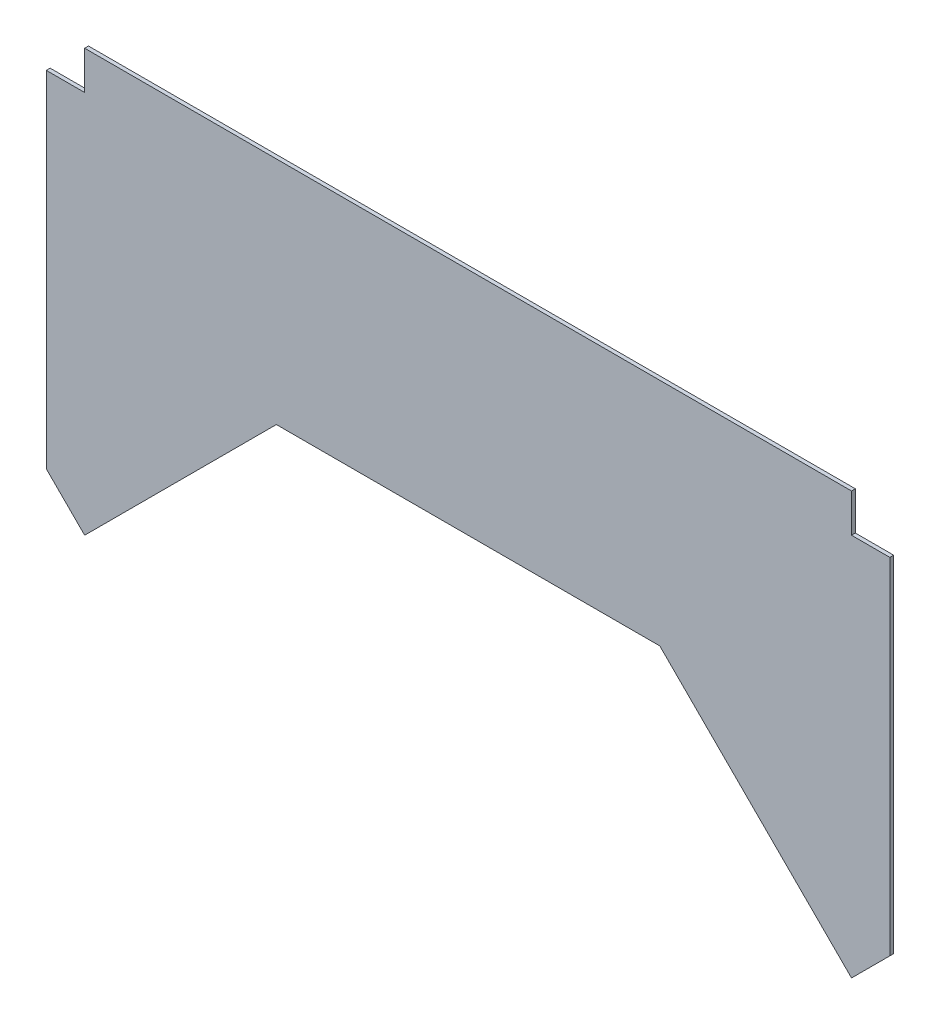
ISO-10303-21;
HEADER;
FILE_DESCRIPTION(('STEP AP214'),'2;1');
FILE_NAME('part.step','',(''),(''),'','','');
FILE_SCHEMA(('AUTOMOTIVE_DESIGN { 1 0 10303 214 1 1 1 1 }'));
ENDSEC;
DATA;
#1=APPLICATION_CONTEXT('core data for automotive mechanical design processes');
#2=APPLICATION_PROTOCOL_DEFINITION('international standard','automotive_design',2000,#1);
#3=PRODUCT_CONTEXT('',#1,'mechanical');
#4=PRODUCT('Part','Part','',(#3));
#5=PRODUCT_RELATED_PRODUCT_CATEGORY('part','',(#4));
#6=PRODUCT_DEFINITION_FORMATION('','',#4);
#7=PRODUCT_DEFINITION_CONTEXT('part definition',#1,'design');
#8=PRODUCT_DEFINITION('design','',#6,#7);
#9=PRODUCT_DEFINITION_SHAPE('','',#8);
#10=(LENGTH_UNIT() NAMED_UNIT(*) SI_UNIT(.MILLI.,.METRE.));
#11=(NAMED_UNIT(*) PLANE_ANGLE_UNIT() SI_UNIT($,.RADIAN.));
#12=(NAMED_UNIT(*) SI_UNIT($,.STERADIAN.) SOLID_ANGLE_UNIT());
#13=UNCERTAINTY_MEASURE_WITH_UNIT(LENGTH_MEASURE(1.E-05),#10,'distance_accuracy_value','');
#14=(GEOMETRIC_REPRESENTATION_CONTEXT(3) GLOBAL_UNCERTAINTY_ASSIGNED_CONTEXT((#13)) GLOBAL_UNIT_ASSIGNED_CONTEXT((#10,
#11,#12)) REPRESENTATION_CONTEXT('',''));
#15=CARTESIAN_POINT('',(0.,0.,0.));
#16=DIRECTION('',(0.,0.,1.));
#17=DIRECTION('',(1.,0.,0.));
#18=AXIS2_PLACEMENT_3D('',#15,#16,#17);
#19=CARTESIAN_POINT('',(110.,0.,1.));
#20=DIRECTION('',(-1.,0.,0.));
#21=DIRECTION('',(0.,0.,1.));
#22=AXIS2_PLACEMENT_3D('',#19,#20,#21);
#23=PLANE('',#22);
#24=DIRECTION('',(0.,1.,0.));
#25=VECTOR('',#24,1.);
#26=CARTESIAN_POINT('',(110.,0.,0.));
#27=LINE('',#26,#25);
#28=CARTESIAN_POINT('',(110.,-89.9999999999999,0.));
#29=VERTEX_POINT('',#28);
#30=CARTESIAN_POINT('',(110.,0.,0.));
#31=VERTEX_POINT('',#30);
#32=EDGE_CURVE('E153',#29,#31,#27,.T.);
#33=ORIENTED_EDGE('',*,*,#32,.T.);
#34=DIRECTION('',(0.,0.,-1.));
#35=VECTOR('',#34,1.);
#36=CARTESIAN_POINT('',(110.,0.,1.));
#37=LINE('',#36,#35);
#38=CARTESIAN_POINT('',(110.,0.,1.));
#39=VERTEX_POINT('',#38);
#40=EDGE_CURVE('E11',#39,#31,#37,.T.);
#41=ORIENTED_EDGE('',*,*,#40,.F.);
#42=DIRECTION('',(0.,1.,0.));
#43=VECTOR('',#42,1.);
#44=CARTESIAN_POINT('',(110.,0.,1.));
#45=LINE('',#44,#43);
#46=CARTESIAN_POINT('',(110.,-89.9999999999999,1.));
#47=VERTEX_POINT('',#46);
#48=EDGE_CURVE('E175',#47,#39,#45,.T.);
#49=ORIENTED_EDGE('',*,*,#48,.F.);
#50=DIRECTION('',(0.,0.,-1.));
#51=VECTOR('',#50,1.);
#52=CARTESIAN_POINT('',(110.,-89.9999999999999,1.));
#53=LINE('',#52,#51);
#54=EDGE_CURVE('E149',#47,#29,#53,.T.);
#55=ORIENTED_EDGE('',*,*,#54,.T.);
#56=EDGE_LOOP('',(#33,#41,#49,#55));
#57=FACE_BOUND('',#56,.T.);
#58=ADVANCED_FACE('F33',(#57),#23,.F.);
#59=CARTESIAN_POINT('',(110.,0.,1.));
#60=DIRECTION('',(0.,-1.,0.));
#61=DIRECTION('',(0.,0.,-1.));
#62=AXIS2_PLACEMENT_3D('',#59,#60,#61);
#63=PLANE('',#62);
#64=DIRECTION('',(-1.,0.,0.));
#65=VECTOR('',#64,1.);
#66=CARTESIAN_POINT('',(110.,0.,0.));
#67=LINE('',#66,#65);
#68=CARTESIAN_POINT('',(100.,0.,0.));
#69=VERTEX_POINT('',#68);
#70=EDGE_CURVE('E156',#31,#69,#67,.T.);
#71=ORIENTED_EDGE('',*,*,#70,.T.);
#72=DIRECTION('',(0.,0.,-1.));
#73=VECTOR('',#72,1.);
#74=CARTESIAN_POINT('',(100.,0.,1.));
#75=LINE('',#74,#73);
#76=CARTESIAN_POINT('',(100.,0.,1.));
#77=VERTEX_POINT('',#76);
#78=EDGE_CURVE('E41',#77,#69,#75,.T.);
#79=ORIENTED_EDGE('',*,*,#78,.F.);
#80=DIRECTION('',(-1.,0.,0.));
#81=VECTOR('',#80,1.);
#82=CARTESIAN_POINT('',(110.,0.,1.));
#83=LINE('',#82,#81);
#84=EDGE_CURVE('E104',#39,#77,#83,.T.);
#85=ORIENTED_EDGE('',*,*,#84,.F.);
#86=ORIENTED_EDGE('',*,*,#40,.T.);
#87=EDGE_LOOP('',(#71,#79,#85,#86));
#88=FACE_BOUND('',#87,.T.);
#89=ADVANCED_FACE('F253',(#88),#63,.F.);
#90=CARTESIAN_POINT('',(100.,10.,1.));
#91=DIRECTION('',(-1.,0.,0.));
#92=DIRECTION('',(0.,-1.,0.));
#93=AXIS2_PLACEMENT_3D('',#90,#91,#92);
#94=PLANE('',#93);
#95=DIRECTION('',(0.,1.,0.));
#96=VECTOR('',#95,1.);
#97=CARTESIAN_POINT('',(100.,10.,0.));
#98=LINE('',#97,#96);
#99=CARTESIAN_POINT('',(100.,10.,0.));
#100=VERTEX_POINT('',#99);
#101=EDGE_CURVE('E158',#69,#100,#98,.T.);
#102=ORIENTED_EDGE('',*,*,#101,.T.);
#103=DIRECTION('',(0.,0.,-1.));
#104=VECTOR('',#103,1.);
#105=CARTESIAN_POINT('',(100.,10.,1.));
#106=LINE('',#105,#104);
#107=CARTESIAN_POINT('',(100.,10.,1.));
#108=VERTEX_POINT('',#107);
#109=EDGE_CURVE('E194',#108,#100,#106,.T.);
#110=ORIENTED_EDGE('',*,*,#109,.F.);
#111=DIRECTION('',(0.,1.,0.));
#112=VECTOR('',#111,1.);
#113=CARTESIAN_POINT('',(100.,10.,1.));
#114=LINE('',#113,#112);
#115=EDGE_CURVE('E202',#77,#108,#114,.T.);
#116=ORIENTED_EDGE('',*,*,#115,.F.);
#117=ORIENTED_EDGE('',*,*,#78,.T.);
#118=EDGE_LOOP('',(#102,#110,#116,#117));
#119=FACE_BOUND('',#118,.T.);
#120=ADVANCED_FACE('F200',(#119),#94,.F.);
#121=CARTESIAN_POINT('',(-100.,9.99999999999998,1.));
#122=DIRECTION('',(0.,-1.,0.));
#123=DIRECTION('',(1.,0.,0.));
#124=AXIS2_PLACEMENT_3D('',#121,#122,#123);
#125=PLANE('',#124);
#126=DIRECTION('',(-1.,0.,0.));
#127=VECTOR('',#126,1.);
#128=CARTESIAN_POINT('',(-100.,9.99999999999998,0.));
#129=LINE('',#128,#127);
#130=CARTESIAN_POINT('',(-100.,9.99999999999998,0.));
#131=VERTEX_POINT('',#130);
#132=EDGE_CURVE('E160',#100,#131,#129,.T.);
#133=ORIENTED_EDGE('',*,*,#132,.T.);
#134=DIRECTION('',(0.,0.,-1.));
#135=VECTOR('',#134,1.);
#136=CARTESIAN_POINT('',(-100.,9.99999999999998,1.));
#137=LINE('',#136,#135);
#138=CARTESIAN_POINT('',(-100.,9.99999999999998,1.));
#139=VERTEX_POINT('',#138);
#140=EDGE_CURVE('E191',#139,#131,#137,.T.);
#141=ORIENTED_EDGE('',*,*,#140,.F.);
#142=DIRECTION('',(-1.,0.,0.));
#143=VECTOR('',#142,1.);
#144=CARTESIAN_POINT('',(-100.,9.99999999999998,1.));
#145=LINE('',#144,#143);
#146=EDGE_CURVE('E220',#108,#139,#145,.T.);
#147=ORIENTED_EDGE('',*,*,#146,.F.);
#148=ORIENTED_EDGE('',*,*,#109,.T.);
#149=EDGE_LOOP('',(#133,#141,#147,#148));
#150=FACE_BOUND('',#149,.T.);
#151=ADVANCED_FACE('F211',(#150),#125,.F.);
#152=CARTESIAN_POINT('',(-100.,0.,1.));
#153=DIRECTION('',(1.,0.,0.));
#154=DIRECTION('',(0.,1.,0.));
#155=AXIS2_PLACEMENT_3D('',#152,#153,#154);
#156=PLANE('',#155);
#157=DIRECTION('',(0.,-1.,0.));
#158=VECTOR('',#157,1.);
#159=CARTESIAN_POINT('',(-100.,0.,0.));
#160=LINE('',#159,#158);
#161=CARTESIAN_POINT('',(-100.,0.,0.));
#162=VERTEX_POINT('',#161);
#163=EDGE_CURVE('E162',#131,#162,#160,.T.);
#164=ORIENTED_EDGE('',*,*,#163,.T.);
#165=DIRECTION('',(0.,0.,-1.));
#166=VECTOR('',#165,1.);
#167=CARTESIAN_POINT('',(-100.,0.,1.));
#168=LINE('',#167,#166);
#169=CARTESIAN_POINT('',(-100.,0.,1.));
#170=VERTEX_POINT('',#169);
#171=EDGE_CURVE('E188',#170,#162,#168,.T.);
#172=ORIENTED_EDGE('',*,*,#171,.F.);
#173=DIRECTION('',(0.,-1.,0.));
#174=VECTOR('',#173,1.);
#175=CARTESIAN_POINT('',(-100.,0.,1.));
#176=LINE('',#175,#174);
#177=EDGE_CURVE('E217',#139,#170,#176,.T.);
#178=ORIENTED_EDGE('',*,*,#177,.F.);
#179=ORIENTED_EDGE('',*,*,#140,.T.);
#180=EDGE_LOOP('',(#164,#172,#178,#179));
#181=FACE_BOUND('',#180,.T.);
#182=ADVANCED_FACE('F215',(#181),#156,.F.);
#183=CARTESIAN_POINT('',(-110.,0.,1.));
#184=DIRECTION('',(0.,-1.,0.));
#185=DIRECTION('',(1.,0.,0.));
#186=AXIS2_PLACEMENT_3D('',#183,#184,#185);
#187=PLANE('',#186);
#188=DIRECTION('',(-1.,0.,0.));
#189=VECTOR('',#188,1.);
#190=CARTESIAN_POINT('',(-110.,0.,0.));
#191=LINE('',#190,#189);
#192=CARTESIAN_POINT('',(-110.,0.,0.));
#193=VERTEX_POINT('',#192);
#194=EDGE_CURVE('E164',#162,#193,#191,.T.);
#195=ORIENTED_EDGE('',*,*,#194,.T.);
#196=DIRECTION('',(0.,0.,-1.));
#197=VECTOR('',#196,1.);
#198=CARTESIAN_POINT('',(-110.,0.,1.));
#199=LINE('',#198,#197);
#200=CARTESIAN_POINT('',(-110.,0.,1.));
#201=VERTEX_POINT('',#200);
#202=EDGE_CURVE('E185',#201,#193,#199,.T.);
#203=ORIENTED_EDGE('',*,*,#202,.F.);
#204=DIRECTION('',(-1.,0.,0.));
#205=VECTOR('',#204,1.);
#206=CARTESIAN_POINT('',(-110.,0.,1.));
#207=LINE('',#206,#205);
#208=EDGE_CURVE('E219',#170,#201,#207,.T.);
#209=ORIENTED_EDGE('',*,*,#208,.F.);
#210=ORIENTED_EDGE('',*,*,#171,.T.);
#211=EDGE_LOOP('',(#195,#203,#209,#210));
#212=FACE_BOUND('',#211,.T.);
#213=ADVANCED_FACE('F266',(#212),#187,.F.);
#214=CARTESIAN_POINT('',(-110.,0.,1.));
#215=DIRECTION('',(1.,0.,0.));
#216=DIRECTION('',(0.,1.,0.));
#217=AXIS2_PLACEMENT_3D('',#214,#215,#216);
#218=PLANE('',#217);
#219=DIRECTION('',(0.,-1.,0.));
#220=VECTOR('',#219,1.);
#221=CARTESIAN_POINT('',(-110.,0.,0.));
#222=LINE('',#221,#220);
#223=CARTESIAN_POINT('',(-110.,-89.9999999999999,0.));
#224=VERTEX_POINT('',#223);
#225=EDGE_CURVE('E166',#193,#224,#222,.T.);
#226=ORIENTED_EDGE('',*,*,#225,.T.);
#227=DIRECTION('',(0.,0.,-1.));
#228=VECTOR('',#227,1.);
#229=CARTESIAN_POINT('',(-110.,-89.9999999999999,1.));
#230=LINE('',#229,#228);
#231=CARTESIAN_POINT('',(-110.,-89.9999999999999,1.));
#232=VERTEX_POINT('',#231);
#233=EDGE_CURVE('E182',#232,#224,#230,.T.);
#234=ORIENTED_EDGE('',*,*,#233,.F.);
#235=DIRECTION('',(0.,-1.,0.));
#236=VECTOR('',#235,1.);
#237=CARTESIAN_POINT('',(-110.,0.,1.));
#238=LINE('',#237,#236);
#239=EDGE_CURVE('E222',#201,#232,#238,.T.);
#240=ORIENTED_EDGE('',*,*,#239,.F.);
#241=ORIENTED_EDGE('',*,*,#202,.T.);
#242=EDGE_LOOP('',(#226,#234,#240,#241));
#243=FACE_BOUND('',#242,.T.);
#244=ADVANCED_FACE('F269',(#243),#218,.F.);
#245=CARTESIAN_POINT('',(-110.,-89.9999999999999,1.));
#246=DIRECTION('',(0.707106781186551,0.707106781186544,0.));
#247=DIRECTION('',(-0.707106781186544,0.707106781186551,0.));
#248=AXIS2_PLACEMENT_3D('',#245,#246,#247);
#249=PLANE('',#248);
#250=DIRECTION('',(0.707106781186544,-0.707106781186551,0.));
#251=VECTOR('',#250,1.);
#252=CARTESIAN_POINT('',(-110.,-89.9999999999999,0.));
#253=LINE('',#252,#251);
#254=CARTESIAN_POINT('',(-100.,-99.9999999999999,0.));
#255=VERTEX_POINT('',#254);
#256=EDGE_CURVE('E168',#224,#255,#253,.T.);
#257=ORIENTED_EDGE('',*,*,#256,.T.);
#258=DIRECTION('',(0.,0.,-1.));
#259=VECTOR('',#258,1.);
#260=CARTESIAN_POINT('',(-100.,-99.9999999999999,1.));
#261=LINE('',#260,#259);
#262=CARTESIAN_POINT('',(-100.,-99.9999999999999,1.));
#263=VERTEX_POINT('',#262);
#264=EDGE_CURVE('E179',#263,#255,#261,.T.);
#265=ORIENTED_EDGE('',*,*,#264,.F.);
#266=DIRECTION('',(0.707106781186544,-0.707106781186551,0.));
#267=VECTOR('',#266,1.);
#268=CARTESIAN_POINT('',(-110.,-89.9999999999999,1.));
#269=LINE('',#268,#267);
#270=EDGE_CURVE('E228',#232,#263,#269,.T.);
#271=ORIENTED_EDGE('',*,*,#270,.F.);
#272=ORIENTED_EDGE('',*,*,#233,.T.);
#273=EDGE_LOOP('',(#257,#265,#271,#272));
#274=FACE_BOUND('',#273,.T.);
#275=ADVANCED_FACE('F234',(#274),#249,.F.);
#276=CARTESIAN_POINT('',(-100.,-99.9999999999999,1.));
#277=DIRECTION('',(-0.707106781186547,0.707106781186547,0.));
#278=DIRECTION('',(-0.707106781186548,-0.707106781186548,0.));
#279=AXIS2_PLACEMENT_3D('',#276,#277,#278);
#280=PLANE('',#279);
#281=DIRECTION('',(0.707106781186547,0.707106781186547,0.));
#282=VECTOR('',#281,1.);
#283=CARTESIAN_POINT('',(-100.,-99.9999999999999,0.));
#284=LINE('',#283,#282);
#285=CARTESIAN_POINT('',(-50.,-50.,0.));
#286=VERTEX_POINT('',#285);
#287=EDGE_CURVE('E170',#255,#286,#284,.T.);
#288=ORIENTED_EDGE('',*,*,#287,.T.);
#289=DIRECTION('',(0.,0.,-1.));
#290=VECTOR('',#289,1.);
#291=CARTESIAN_POINT('',(-50.,-50.,1.));
#292=LINE('',#291,#290);
#293=CARTESIAN_POINT('',(-50.,-50.,1.));
#294=VERTEX_POINT('',#293);
#295=EDGE_CURVE('E144',#294,#286,#292,.T.);
#296=ORIENTED_EDGE('',*,*,#295,.F.);
#297=DIRECTION('',(0.707106781186547,0.707106781186547,0.));
#298=VECTOR('',#297,1.);
#299=CARTESIAN_POINT('',(-100.,-99.9999999999999,1.));
#300=LINE('',#299,#298);
#301=EDGE_CURVE('E135',#263,#294,#300,.T.);
#302=ORIENTED_EDGE('',*,*,#301,.F.);
#303=ORIENTED_EDGE('',*,*,#264,.T.);
#304=EDGE_LOOP('',(#288,#296,#302,#303));
#305=FACE_BOUND('',#304,.T.);
#306=ADVANCED_FACE('F238',(#305),#280,.F.);
#307=CARTESIAN_POINT('',(-50.,-50.,1.));
#308=DIRECTION('',(0.,1.,0.));
#309=DIRECTION('',(-1.,0.,0.));
#310=AXIS2_PLACEMENT_3D('',#307,#308,#309);
#311=PLANE('',#310);
#312=DIRECTION('',(1.,0.,0.));
#313=VECTOR('',#312,1.);
#314=CARTESIAN_POINT('',(-50.,-50.,0.));
#315=LINE('',#314,#313);
#316=CARTESIAN_POINT('',(50.,-50.,0.));
#317=VERTEX_POINT('',#316);
#318=EDGE_CURVE('E143',#286,#317,#315,.T.);
#319=ORIENTED_EDGE('',*,*,#318,.T.);
#320=DIRECTION('',(0.,0.,-1.));
#321=VECTOR('',#320,1.);
#322=CARTESIAN_POINT('',(50.,-50.,1.));
#323=LINE('',#322,#321);
#324=CARTESIAN_POINT('',(50.,-50.,1.));
#325=VERTEX_POINT('',#324);
#326=EDGE_CURVE('E140',#325,#317,#323,.T.);
#327=ORIENTED_EDGE('',*,*,#326,.F.);
#328=DIRECTION('',(1.,0.,0.));
#329=VECTOR('',#328,1.);
#330=CARTESIAN_POINT('',(-50.,-50.,1.));
#331=LINE('',#330,#329);
#332=EDGE_CURVE('E129',#294,#325,#331,.T.);
#333=ORIENTED_EDGE('',*,*,#332,.F.);
#334=ORIENTED_EDGE('',*,*,#295,.T.);
#335=EDGE_LOOP('',(#319,#327,#333,#334));
#336=FACE_BOUND('',#335,.T.);
#337=ADVANCED_FACE('F141',(#336),#311,.F.);
#338=CARTESIAN_POINT('',(100.,-99.9999999999999,1.));
#339=DIRECTION('',(0.707106781186547,0.707106781186548,0.));
#340=DIRECTION('',(-0.707106781186548,0.707106781186547,0.));
#341=AXIS2_PLACEMENT_3D('',#338,#339,#340);
#342=PLANE('',#341);
#343=DIRECTION('',(0.707106781186548,-0.707106781186547,0.));
#344=VECTOR('',#343,1.);
#345=CARTESIAN_POINT('',(100.,-99.9999999999999,0.));
#346=LINE('',#345,#344);
#347=CARTESIAN_POINT('',(100.,-99.9999999999999,0.));
#348=VERTEX_POINT('',#347);
#349=EDGE_CURVE('E90',#317,#348,#346,.T.);
#350=ORIENTED_EDGE('',*,*,#349,.T.);
#351=DIRECTION('',(0.,0.,-1.));
#352=VECTOR('',#351,1.);
#353=CARTESIAN_POINT('',(100.,-99.9999999999999,1.));
#354=LINE('',#353,#352);
#355=CARTESIAN_POINT('',(100.,-99.9999999999999,1.));
#356=VERTEX_POINT('',#355);
#357=EDGE_CURVE('E145',#356,#348,#354,.T.);
#358=ORIENTED_EDGE('',*,*,#357,.F.);
#359=DIRECTION('',(0.707106781186548,-0.707106781186547,0.));
#360=VECTOR('',#359,1.);
#361=CARTESIAN_POINT('',(100.,-99.9999999999999,1.));
#362=LINE('',#361,#360);
#363=EDGE_CURVE('E133',#325,#356,#362,.T.);
#364=ORIENTED_EDGE('',*,*,#363,.F.);
#365=ORIENTED_EDGE('',*,*,#326,.T.);
#366=EDGE_LOOP('',(#350,#358,#364,#365));
#367=FACE_BOUND('',#366,.T.);
#368=ADVANCED_FACE('F147',(#367),#342,.F.);
#369=CARTESIAN_POINT('',(110.,-89.9999999999999,1.));
#370=DIRECTION('',(-0.70710678118655,0.707106781186545,0.));
#371=DIRECTION('',(-0.707106781186545,-0.70710678118655,0.));
#372=AXIS2_PLACEMENT_3D('',#369,#370,#371);
#373=PLANE('',#372);
#374=DIRECTION('',(0.707106781186545,0.70710678118655,0.));
#375=VECTOR('',#374,1.);
#376=CARTESIAN_POINT('',(110.,-89.9999999999999,0.));
#377=LINE('',#376,#375);
#378=EDGE_CURVE('E96',#348,#29,#377,.T.);
#379=ORIENTED_EDGE('',*,*,#378,.T.);
#380=ORIENTED_EDGE('',*,*,#54,.F.);
#381=DIRECTION('',(0.707106781186545,0.70710678118655,0.));
#382=VECTOR('',#381,1.);
#383=CARTESIAN_POINT('',(110.,-89.9999999999999,1.));
#384=LINE('',#383,#382);
#385=EDGE_CURVE('E49',#356,#47,#384,.T.);
#386=ORIENTED_EDGE('',*,*,#385,.F.);
#387=ORIENTED_EDGE('',*,*,#357,.T.);
#388=EDGE_LOOP('',(#379,#380,#386,#387));
#389=FACE_BOUND('',#388,.T.);
#390=ADVANCED_FACE('F242',(#389),#373,.F.);
#391=CARTESIAN_POINT('',(0.,0.,1.));
#392=DIRECTION('',(0.,0.,1.));
#393=DIRECTION('',(1.,0.,0.));
#394=AXIS2_PLACEMENT_3D('',#391,#392,#393);
#395=PLANE('',#394);
#396=ORIENTED_EDGE('',*,*,#48,.T.);
#397=ORIENTED_EDGE('',*,*,#84,.T.);
#398=ORIENTED_EDGE('',*,*,#115,.T.);
#399=ORIENTED_EDGE('',*,*,#146,.T.);
#400=ORIENTED_EDGE('',*,*,#177,.T.);
#401=ORIENTED_EDGE('',*,*,#208,.T.);
#402=ORIENTED_EDGE('',*,*,#239,.T.);
#403=ORIENTED_EDGE('',*,*,#270,.T.);
#404=ORIENTED_EDGE('',*,*,#301,.T.);
#405=ORIENTED_EDGE('',*,*,#332,.T.);
#406=ORIENTED_EDGE('',*,*,#363,.T.);
#407=ORIENTED_EDGE('',*,*,#385,.T.);
#408=EDGE_LOOP('',(#396,#397,#398,#399,#400,#401,#402,#403,#404,#405,#406,#407));
#409=FACE_BOUND('',#408,.T.);
#410=ADVANCED_FACE('F131',(#409),#395,.T.);
#411=CARTESIAN_POINT('',(0.,0.,0.));
#412=DIRECTION('',(0.,0.,1.));
#413=DIRECTION('',(1.,0.,0.));
#414=AXIS2_PLACEMENT_3D('',#411,#412,#413);
#415=PLANE('',#414);
#416=ORIENTED_EDGE('',*,*,#32,.F.);
#417=ORIENTED_EDGE('',*,*,#378,.F.);
#418=ORIENTED_EDGE('',*,*,#349,.F.);
#419=ORIENTED_EDGE('',*,*,#318,.F.);
#420=ORIENTED_EDGE('',*,*,#287,.F.);
#421=ORIENTED_EDGE('',*,*,#256,.F.);
#422=ORIENTED_EDGE('',*,*,#225,.F.);
#423=ORIENTED_EDGE('',*,*,#194,.F.);
#424=ORIENTED_EDGE('',*,*,#163,.F.);
#425=ORIENTED_EDGE('',*,*,#132,.F.);
#426=ORIENTED_EDGE('',*,*,#101,.F.);
#427=ORIENTED_EDGE('',*,*,#70,.F.);
#428=EDGE_LOOP('',(#416,#417,#418,#419,#420,#421,#422,#423,#424,#425,#426,#427));
#429=FACE_BOUND('',#428,.T.);
#430=ADVANCED_FACE('F206',(#429),#415,.F.);
#431=CLOSED_SHELL('',(#58,#89,#120,#151,#182,#213,#244,#275,#306,#337,#368,#390,#410,#430));
#432=MANIFOLD_SOLID_BREP('B2',#431);
#433=ADVANCED_BREP_SHAPE_REPRESENTATION('',(#18,#432),#14);
#434=SHAPE_DEFINITION_REPRESENTATION(#9,#433);
ENDSEC;
END-ISO-10303-21;
